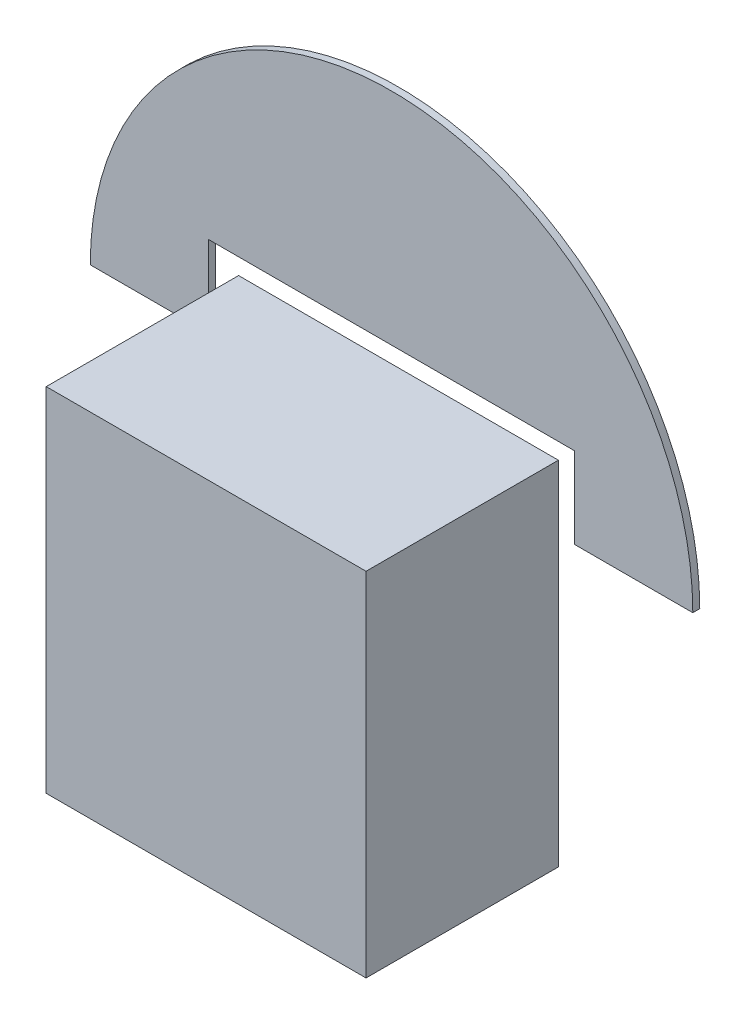
ISO-10303-21;
HEADER;
FILE_DESCRIPTION(('STEP AP214'),'2;1');
FILE_NAME('part.step','',(''),(''),'','','');
FILE_SCHEMA(('AUTOMOTIVE_DESIGN { 1 0 10303 214 1 1 1 1 }'));
ENDSEC;
DATA;
#1=APPLICATION_CONTEXT('core data for automotive mechanical design processes');
#2=APPLICATION_PROTOCOL_DEFINITION('international standard','automotive_design',2000,#1);
#3=PRODUCT_CONTEXT('',#1,'mechanical');
#4=PRODUCT('Part','Part','',(#3));
#5=PRODUCT_RELATED_PRODUCT_CATEGORY('part','',(#4));
#6=PRODUCT_DEFINITION_FORMATION('','',#4);
#7=PRODUCT_DEFINITION_CONTEXT('part definition',#1,'design');
#8=PRODUCT_DEFINITION('design','',#6,#7);
#9=PRODUCT_DEFINITION_SHAPE('','',#8);
#10=(LENGTH_UNIT() NAMED_UNIT(*) SI_UNIT(.MILLI.,.METRE.));
#11=(NAMED_UNIT(*) PLANE_ANGLE_UNIT() SI_UNIT($,.RADIAN.));
#12=(NAMED_UNIT(*) SI_UNIT($,.STERADIAN.) SOLID_ANGLE_UNIT());
#13=UNCERTAINTY_MEASURE_WITH_UNIT(LENGTH_MEASURE(1.E-05),#10,'distance_accuracy_value','');
#14=(GEOMETRIC_REPRESENTATION_CONTEXT(3) GLOBAL_UNCERTAINTY_ASSIGNED_CONTEXT((#13)) GLOBAL_UNIT_ASSIGNED_CONTEXT((#10,
#11,#12)) REPRESENTATION_CONTEXT('',''));
#15=CARTESIAN_POINT('',(0.,0.,0.));
#16=DIRECTION('',(0.,0.,1.));
#17=DIRECTION('',(1.,0.,0.));
#18=AXIS2_PLACEMENT_3D('',#15,#16,#17);
#19=CARTESIAN_POINT('',(23.262557024026,532.440801129921,30.));
#20=DIRECTION('',(0.,0.,-1.));
#21=DIRECTION('',(-1.,0.,0.));
#22=AXIS2_PLACEMENT_3D('',#19,#20,#21);
#23=CYLINDRICAL_SURFACE('',#22,1300.);
#24=CARTESIAN_POINT('',(23.262557024026,532.440801129921,0.));
#25=DIRECTION('',(0.,0.,1.));
#26=DIRECTION('',(1.,0.,0.));
#27=AXIS2_PLACEMENT_3D('',#24,#25,#26);
#28=CIRCLE('',#27,1300.);
#29=CARTESIAN_POINT('',(1323.26255702403,532.44080112992,0.));
#30=VERTEX_POINT('',#29);
#31=CARTESIAN_POINT('',(-1276.73744297597,532.44080112992,0.));
#32=VERTEX_POINT('',#31);
#33=EDGE_CURVE('E190',#30,#32,#28,.T.);
#34=ORIENTED_EDGE('',*,*,#33,.T.);
#35=DIRECTION('',(0.,0.,-1.));
#36=VECTOR('',#35,1.);
#37=CARTESIAN_POINT('',(-1276.73744297597,532.44080112992,30.));
#38=LINE('',#37,#36);
#39=CARTESIAN_POINT('',(-1276.73744297597,532.44080112992,30.));
#40=VERTEX_POINT('',#39);
#41=EDGE_CURVE('E13',#40,#32,#38,.T.);
#42=ORIENTED_EDGE('',*,*,#41,.F.);
#43=CARTESIAN_POINT('',(23.262557024026,532.440801129921,30.));
#44=DIRECTION('',(0.,0.,1.));
#45=DIRECTION('',(1.,0.,0.));
#46=AXIS2_PLACEMENT_3D('',#43,#44,#45);
#47=CIRCLE('',#46,1300.);
#48=CARTESIAN_POINT('',(1323.26255702403,532.44080112992,30.));
#49=VERTEX_POINT('',#48);
#50=EDGE_CURVE('E211',#49,#40,#47,.T.);
#51=ORIENTED_EDGE('',*,*,#50,.F.);
#52=DIRECTION('',(0.,0.,-1.));
#53=VECTOR('',#52,1.);
#54=CARTESIAN_POINT('',(1323.26255702403,532.44080112992,30.));
#55=LINE('',#54,#53);
#56=EDGE_CURVE('E206',#49,#30,#55,.T.);
#57=ORIENTED_EDGE('',*,*,#56,.T.);
#58=EDGE_LOOP('',(#34,#42,#51,#57));
#59=FACE_BOUND('',#58,.T.);
#60=ADVANCED_FACE('F133',(#59),#23,.T.);
#61=CARTESIAN_POINT('',(0.,532.440801129921,30.));
#62=DIRECTION('',(0.,-1.,0.));
#63=DIRECTION('',(1.,0.,0.));
#64=AXIS2_PLACEMENT_3D('',#61,#62,#63);
#65=PLANE('',#64);
#66=DIRECTION('',(-1.,0.,0.));
#67=VECTOR('',#66,1.);
#68=CARTESIAN_POINT('',(0.,532.440801129921,0.));
#69=LINE('',#68,#67);
#70=CARTESIAN_POINT('',(-766.737442975974,532.44080112992,0.));
#71=VERTEX_POINT('',#70);
#72=EDGE_CURVE('E196',#71,#32,#69,.T.);
#73=ORIENTED_EDGE('',*,*,#72,.F.);
#74=DIRECTION('',(0.,0.,-1.));
#75=VECTOR('',#74,1.);
#76=CARTESIAN_POINT('',(-766.737442975974,532.44080112992,30.));
#77=LINE('',#76,#75);
#78=CARTESIAN_POINT('',(-766.737442975974,532.44080112992,30.));
#79=VERTEX_POINT('',#78);
#80=EDGE_CURVE('E143',#79,#71,#77,.T.);
#81=ORIENTED_EDGE('',*,*,#80,.F.);
#82=DIRECTION('',(-1.,0.,0.));
#83=VECTOR('',#82,1.);
#84=CARTESIAN_POINT('',(0.,532.440801129921,30.));
#85=LINE('',#84,#83);
#86=EDGE_CURVE('E236',#79,#40,#85,.T.);
#87=ORIENTED_EDGE('',*,*,#86,.T.);
#88=ORIENTED_EDGE('',*,*,#41,.T.);
#89=EDGE_LOOP('',(#73,#81,#87,#88));
#90=FACE_BOUND('',#89,.T.);
#91=ADVANCED_FACE('F242',(#90),#65,.T.);
#92=CARTESIAN_POINT('',(-766.737442975974,0.,30.));
#93=DIRECTION('',(1.,0.,0.));
#94=DIRECTION('',(0.,1.,0.));
#95=AXIS2_PLACEMENT_3D('',#92,#93,#94);
#96=PLANE('',#95);
#97=DIRECTION('',(0.,-1.,0.));
#98=VECTOR('',#97,1.);
#99=CARTESIAN_POINT('',(-766.737442975974,0.,0.));
#100=LINE('',#99,#98);
#101=CARTESIAN_POINT('',(-766.737442975974,882.440801129921,0.));
#102=VERTEX_POINT('',#101);
#103=EDGE_CURVE('E232',#102,#71,#100,.T.);
#104=ORIENTED_EDGE('',*,*,#103,.F.);
#105=DIRECTION('',(0.,0.,-1.));
#106=VECTOR('',#105,1.);
#107=CARTESIAN_POINT('',(-766.737442975974,882.440801129921,30.));
#108=LINE('',#107,#106);
#109=CARTESIAN_POINT('',(-766.737442975974,882.440801129921,30.));
#110=VERTEX_POINT('',#109);
#111=EDGE_CURVE('E152',#110,#102,#108,.T.);
#112=ORIENTED_EDGE('',*,*,#111,.F.);
#113=DIRECTION('',(0.,-1.,0.));
#114=VECTOR('',#113,1.);
#115=CARTESIAN_POINT('',(-766.737442975974,0.,30.));
#116=LINE('',#115,#114);
#117=EDGE_CURVE('E231',#110,#79,#116,.T.);
#118=ORIENTED_EDGE('',*,*,#117,.T.);
#119=ORIENTED_EDGE('',*,*,#80,.T.);
#120=EDGE_LOOP('',(#104,#112,#118,#119));
#121=FACE_BOUND('',#120,.T.);
#122=ADVANCED_FACE('F243',(#121),#96,.T.);
#123=CARTESIAN_POINT('',(0.,0.,0.));
#124=DIRECTION('',(0.,0.,1.));
#125=DIRECTION('',(1.,0.,0.));
#126=AXIS2_PLACEMENT_3D('',#123,#124,#125);
#127=PLANE('',#126);
#128=ORIENTED_EDGE('',*,*,#33,.F.);
#129=DIRECTION('',(1.,0.,0.));
#130=VECTOR('',#129,1.);
#131=CARTESIAN_POINT('',(0.,532.44080112992,0.));
#132=LINE('',#131,#130);
#133=CARTESIAN_POINT('',(813.262557024026,532.44080112992,0.));
#134=VERTEX_POINT('',#133);
#135=EDGE_CURVE('E193',#134,#30,#132,.T.);
#136=ORIENTED_EDGE('',*,*,#135,.F.);
#137=DIRECTION('',(0.,-1.,0.));
#138=VECTOR('',#137,1.);
#139=CARTESIAN_POINT('',(813.262557024026,0.,0.));
#140=LINE('',#139,#138);
#141=CARTESIAN_POINT('',(813.262557024026,882.440801129921,0.));
#142=VERTEX_POINT('',#141);
#143=EDGE_CURVE('E183',#142,#134,#140,.T.);
#144=ORIENTED_EDGE('',*,*,#143,.F.);
#145=DIRECTION('',(1.,0.,0.));
#146=VECTOR('',#145,1.);
#147=CARTESIAN_POINT('',(-926.737442975983,882.440801129921,0.));
#148=LINE('',#147,#146);
#149=EDGE_CURVE('E137',#102,#142,#148,.T.);
#150=ORIENTED_EDGE('',*,*,#149,.F.);
#151=ORIENTED_EDGE('',*,*,#103,.T.);
#152=ORIENTED_EDGE('',*,*,#72,.T.);
#153=EDGE_LOOP('',(#128,#136,#144,#150,#151,#152));
#154=FACE_BOUND('',#153,.T.);
#155=ADVANCED_FACE('F192',(#154),#127,.F.);
#156=CARTESIAN_POINT('',(0.,0.,30.));
#157=DIRECTION('',(0.,0.,1.));
#158=DIRECTION('',(1.,0.,0.));
#159=AXIS2_PLACEMENT_3D('',#156,#157,#158);
#160=PLANE('',#159);
#161=DIRECTION('',(1.,0.,0.));
#162=VECTOR('',#161,1.);
#163=CARTESIAN_POINT('',(0.,532.44080112992,30.));
#164=LINE('',#163,#162);
#165=CARTESIAN_POINT('',(813.262557024026,532.44080112992,30.));
#166=VERTEX_POINT('',#165);
#167=EDGE_CURVE('E213',#166,#49,#164,.T.);
#168=ORIENTED_EDGE('',*,*,#167,.T.);
#169=ORIENTED_EDGE('',*,*,#50,.T.);
#170=ORIENTED_EDGE('',*,*,#86,.F.);
#171=ORIENTED_EDGE('',*,*,#117,.F.);
#172=DIRECTION('',(1.,0.,0.));
#173=VECTOR('',#172,1.);
#174=CARTESIAN_POINT('',(-926.737442975983,882.440801129921,30.));
#175=LINE('',#174,#173);
#176=CARTESIAN_POINT('',(813.262557024026,882.440801129921,30.));
#177=VERTEX_POINT('',#176);
#178=EDGE_CURVE('E219',#110,#177,#175,.T.);
#179=ORIENTED_EDGE('',*,*,#178,.T.);
#180=DIRECTION('',(0.,-1.,0.));
#181=VECTOR('',#180,1.);
#182=CARTESIAN_POINT('',(813.262557024026,0.,30.));
#183=LINE('',#182,#181);
#184=EDGE_CURVE('E208',#177,#166,#183,.T.);
#185=ORIENTED_EDGE('',*,*,#184,.T.);
#186=EDGE_LOOP('',(#168,#169,#170,#171,#179,#185));
#187=FACE_BOUND('',#186,.T.);
#188=ADVANCED_FACE('F240',(#187),#160,.T.);
#189=CARTESIAN_POINT('',(0.,532.44080112992,30.));
#190=DIRECTION('',(0.,1.,0.));
#191=DIRECTION('',(0.,0.,1.));
#192=AXIS2_PLACEMENT_3D('',#189,#190,#191);
#193=PLANE('',#192);
#194=ORIENTED_EDGE('',*,*,#135,.T.);
#195=ORIENTED_EDGE('',*,*,#56,.F.);
#196=ORIENTED_EDGE('',*,*,#167,.F.);
#197=DIRECTION('',(0.,0.,-1.));
#198=VECTOR('',#197,1.);
#199=CARTESIAN_POINT('',(813.262557024026,532.44080112992,30.));
#200=LINE('',#199,#198);
#201=EDGE_CURVE('E207',#166,#134,#200,.T.);
#202=ORIENTED_EDGE('',*,*,#201,.T.);
#203=EDGE_LOOP('',(#194,#195,#196,#202));
#204=FACE_BOUND('',#203,.T.);
#205=ADVANCED_FACE('F204',(#204),#193,.F.);
#206=CARTESIAN_POINT('',(813.262557024026,0.,30.));
#207=DIRECTION('',(1.,0.,0.));
#208=DIRECTION('',(0.,1.,0.));
#209=AXIS2_PLACEMENT_3D('',#206,#207,#208);
#210=PLANE('',#209);
#211=ORIENTED_EDGE('',*,*,#143,.T.);
#212=ORIENTED_EDGE('',*,*,#201,.F.);
#213=ORIENTED_EDGE('',*,*,#184,.F.);
#214=DIRECTION('',(0.,0.,-1.));
#215=VECTOR('',#214,1.);
#216=CARTESIAN_POINT('',(813.262557024026,882.440801129921,30.));
#217=LINE('',#216,#215);
#218=EDGE_CURVE('E200',#177,#142,#217,.T.);
#219=ORIENTED_EDGE('',*,*,#218,.T.);
#220=EDGE_LOOP('',(#211,#212,#213,#219));
#221=FACE_BOUND('',#220,.T.);
#222=ADVANCED_FACE('F226',(#221),#210,.F.);
#223=CARTESIAN_POINT('',(-926.737442975983,882.440801129921,30.));
#224=DIRECTION('',(0.,1.,0.));
#225=DIRECTION('',(-1.,0.,0.));
#226=AXIS2_PLACEMENT_3D('',#223,#224,#225);
#227=PLANE('',#226);
#228=ORIENTED_EDGE('',*,*,#178,.F.);
#229=ORIENTED_EDGE('',*,*,#111,.T.);
#230=ORIENTED_EDGE('',*,*,#149,.T.);
#231=ORIENTED_EDGE('',*,*,#218,.F.);
#232=EDGE_LOOP('',(#228,#229,#230,#231));
#233=FACE_BOUND('',#232,.T.);
#234=ADVANCED_FACE('F135',(#233),#227,.F.);
#235=CLOSED_SHELL('',(#60,#91,#122,#155,#188,#205,#222,#234));
#236=MANIFOLD_SOLID_BREP('B2',#235);
#237=CARTESIAN_POINT('',(-666.737442975974,782.440801129921,830.));
#238=DIRECTION('',(0.,1.,0.));
#239=DIRECTION('',(-1.,0.,0.));
#240=AXIS2_PLACEMENT_3D('',#237,#238,#239);
#241=PLANE('',#240);
#242=DIRECTION('',(1.,0.,0.));
#243=VECTOR('',#242,1.);
#244=CARTESIAN_POINT('',(-666.737442975974,782.440801129921,0.));
#245=LINE('',#244,#243);
#246=CARTESIAN_POINT('',(-666.737442975974,782.440801129921,0.));
#247=VERTEX_POINT('',#246);
#248=CARTESIAN_POINT('',(713.262557024026,782.440801129921,0.));
#249=VERTEX_POINT('',#248);
#250=EDGE_CURVE('E438',#247,#249,#245,.T.);
#251=ORIENTED_EDGE('',*,*,#250,.F.);
#252=DIRECTION('',(0.,0.,-1.));
#253=VECTOR('',#252,1.);
#254=CARTESIAN_POINT('',(-666.737442975974,782.440801129921,830.));
#255=LINE('',#254,#253);
#256=CARTESIAN_POINT('',(-666.737442975974,782.440801129921,830.));
#257=VERTEX_POINT('',#256);
#258=EDGE_CURVE('E131',#257,#247,#255,.T.);
#259=ORIENTED_EDGE('',*,*,#258,.F.);
#260=DIRECTION('',(1.,0.,0.));
#261=VECTOR('',#260,1.);
#262=CARTESIAN_POINT('',(-666.737442975974,782.440801129921,830.));
#263=LINE('',#262,#261);
#264=CARTESIAN_POINT('',(713.262557024026,782.440801129921,830.));
#265=VERTEX_POINT('',#264);
#266=EDGE_CURVE('E431',#257,#265,#263,.T.);
#267=ORIENTED_EDGE('',*,*,#266,.T.);
#268=DIRECTION('',(0.,0.,-1.));
#269=VECTOR('',#268,1.);
#270=CARTESIAN_POINT('',(713.262557024026,782.440801129921,830.));
#271=LINE('',#270,#269);
#272=EDGE_CURVE('E370',#265,#249,#271,.T.);
#273=ORIENTED_EDGE('',*,*,#272,.T.);
#274=EDGE_LOOP('',(#251,#259,#267,#273));
#275=FACE_BOUND('',#274,.T.);
#276=ADVANCED_FACE('F367',(#275),#241,.T.);
#277=CARTESIAN_POINT('',(-666.737442975974,782.440801129921,830.));
#278=DIRECTION('',(1.,0.,0.));
#279=DIRECTION('',(0.,1.,0.));
#280=AXIS2_PLACEMENT_3D('',#277,#278,#279);
#281=PLANE('',#280);
#282=DIRECTION('',(0.,-1.,0.));
#283=VECTOR('',#282,1.);
#284=CARTESIAN_POINT('',(-666.737442975974,782.440801129921,0.));
#285=LINE('',#284,#283);
#286=CARTESIAN_POINT('',(-666.737442975974,-737.559198870079,0.));
#287=VERTEX_POINT('',#286);
#288=EDGE_CURVE('E401',#247,#287,#285,.T.);
#289=ORIENTED_EDGE('',*,*,#288,.T.);
#290=DIRECTION('',(0.,0.,-1.));
#291=VECTOR('',#290,1.);
#292=CARTESIAN_POINT('',(-666.737442975974,-737.559198870079,830.));
#293=LINE('',#292,#291);
#294=CARTESIAN_POINT('',(-666.737442975974,-737.559198870079,830.));
#295=VERTEX_POINT('',#294);
#296=EDGE_CURVE('E377',#295,#287,#293,.T.);
#297=ORIENTED_EDGE('',*,*,#296,.F.);
#298=DIRECTION('',(0.,-1.,0.));
#299=VECTOR('',#298,1.);
#300=CARTESIAN_POINT('',(-666.737442975974,782.440801129921,830.));
#301=LINE('',#300,#299);
#302=EDGE_CURVE('E418',#257,#295,#301,.T.);
#303=ORIENTED_EDGE('',*,*,#302,.F.);
#304=ORIENTED_EDGE('',*,*,#258,.T.);
#305=EDGE_LOOP('',(#289,#297,#303,#304));
#306=FACE_BOUND('',#305,.T.);
#307=ADVANCED_FACE('F454',(#306),#281,.F.);
#308=CARTESIAN_POINT('',(-666.737442975974,-737.559198870079,830.));
#309=DIRECTION('',(0.,1.,0.));
#310=DIRECTION('',(0.,0.,1.));
#311=AXIS2_PLACEMENT_3D('',#308,#309,#310);
#312=PLANE('',#311);
#313=DIRECTION('',(1.,0.,0.));
#314=VECTOR('',#313,1.);
#315=CARTESIAN_POINT('',(-666.737442975974,-737.559198870079,0.));
#316=LINE('',#315,#314);
#317=CARTESIAN_POINT('',(713.262557024026,-737.559198870079,0.));
#318=VERTEX_POINT('',#317);
#319=EDGE_CURVE('E426',#287,#318,#316,.T.);
#320=ORIENTED_EDGE('',*,*,#319,.T.);
#321=DIRECTION('',(0.,0.,-1.));
#322=VECTOR('',#321,1.);
#323=CARTESIAN_POINT('',(713.262557024026,-737.559198870079,830.));
#324=LINE('',#323,#322);
#325=CARTESIAN_POINT('',(713.262557024026,-737.559198870079,830.));
#326=VERTEX_POINT('',#325);
#327=EDGE_CURVE('E423',#326,#318,#324,.T.);
#328=ORIENTED_EDGE('',*,*,#327,.F.);
#329=DIRECTION('',(1.,0.,0.));
#330=VECTOR('',#329,1.);
#331=CARTESIAN_POINT('',(-666.737442975974,-737.559198870079,830.));
#332=LINE('',#331,#330);
#333=EDGE_CURVE('E413',#295,#326,#332,.T.);
#334=ORIENTED_EDGE('',*,*,#333,.F.);
#335=ORIENTED_EDGE('',*,*,#296,.T.);
#336=EDGE_LOOP('',(#320,#328,#334,#335));
#337=FACE_BOUND('',#336,.T.);
#338=ADVANCED_FACE('F424',(#337),#312,.F.);
#339=CARTESIAN_POINT('',(713.262557024026,782.440801129921,830.));
#340=DIRECTION('',(1.,0.,0.));
#341=DIRECTION('',(0.,1.,0.));
#342=AXIS2_PLACEMENT_3D('',#339,#340,#341);
#343=PLANE('',#342);
#344=DIRECTION('',(0.,-1.,0.));
#345=VECTOR('',#344,1.);
#346=CARTESIAN_POINT('',(713.262557024026,782.440801129921,0.));
#347=LINE('',#346,#345);
#348=EDGE_CURVE('E442',#249,#318,#347,.T.);
#349=ORIENTED_EDGE('',*,*,#348,.F.);
#350=ORIENTED_EDGE('',*,*,#272,.F.);
#351=DIRECTION('',(0.,-1.,0.));
#352=VECTOR('',#351,1.);
#353=CARTESIAN_POINT('',(713.262557024026,782.440801129921,830.));
#354=LINE('',#353,#352);
#355=EDGE_CURVE('E417',#265,#326,#354,.T.);
#356=ORIENTED_EDGE('',*,*,#355,.T.);
#357=ORIENTED_EDGE('',*,*,#327,.T.);
#358=EDGE_LOOP('',(#349,#350,#356,#357));
#359=FACE_BOUND('',#358,.T.);
#360=ADVANCED_FACE('F429',(#359),#343,.T.);
#361=CARTESIAN_POINT('',(0.,0.,830.));
#362=DIRECTION('',(0.,0.,-1.));
#363=DIRECTION('',(-1.,0.,0.));
#364=AXIS2_PLACEMENT_3D('',#361,#362,#363);
#365=PLANE('',#364);
#366=ORIENTED_EDGE('',*,*,#266,.F.);
#367=ORIENTED_EDGE('',*,*,#302,.T.);
#368=ORIENTED_EDGE('',*,*,#333,.T.);
#369=ORIENTED_EDGE('',*,*,#355,.F.);
#370=EDGE_LOOP('',(#366,#367,#368,#369));
#371=FACE_BOUND('',#370,.T.);
#372=ADVANCED_FACE('F416',(#371),#365,.F.);
#373=CARTESIAN_POINT('',(0.,0.,0.));
#374=DIRECTION('',(0.,0.,-1.));
#375=DIRECTION('',(-1.,0.,0.));
#376=AXIS2_PLACEMENT_3D('',#373,#374,#375);
#377=PLANE('',#376);
#378=ORIENTED_EDGE('',*,*,#250,.T.);
#379=ORIENTED_EDGE('',*,*,#348,.T.);
#380=ORIENTED_EDGE('',*,*,#319,.F.);
#381=ORIENTED_EDGE('',*,*,#288,.F.);
#382=EDGE_LOOP('',(#378,#379,#380,#381));
#383=FACE_BOUND('',#382,.T.);
#384=ADVANCED_FACE('F451',(#383),#377,.T.);
#385=CLOSED_SHELL('',(#276,#307,#338,#360,#372,#384));
#386=MANIFOLD_SOLID_BREP('B7',#385);
#387=ADVANCED_BREP_SHAPE_REPRESENTATION('',(#18,#236,#386),#14);
#388=SHAPE_DEFINITION_REPRESENTATION(#9,#387);
ENDSEC;
END-ISO-10303-21;
